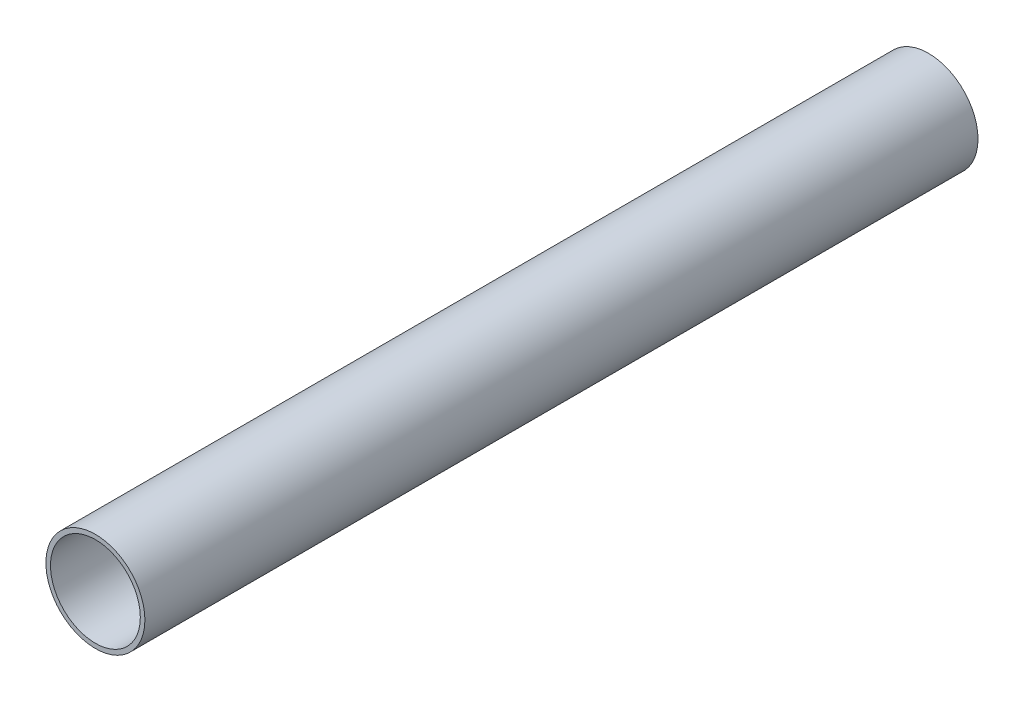
ISO-10303-21;
HEADER;
FILE_DESCRIPTION(('STEP AP214'),'2;1');
FILE_NAME('part.step','',(''),(''),'','','');
FILE_SCHEMA(('AUTOMOTIVE_DESIGN { 1 0 10303 214 1 1 1 1 }'));
ENDSEC;
DATA;
#1=APPLICATION_CONTEXT('core data for automotive mechanical design processes');
#2=APPLICATION_PROTOCOL_DEFINITION('international standard','automotive_design',2000,#1);
#3=PRODUCT_CONTEXT('',#1,'mechanical');
#4=PRODUCT('Part','Part','',(#3));
#5=PRODUCT_RELATED_PRODUCT_CATEGORY('part','',(#4));
#6=PRODUCT_DEFINITION_FORMATION('','',#4);
#7=PRODUCT_DEFINITION_CONTEXT('part definition',#1,'design');
#8=PRODUCT_DEFINITION('design','',#6,#7);
#9=PRODUCT_DEFINITION_SHAPE('','',#8);
#10=(LENGTH_UNIT() NAMED_UNIT(*) SI_UNIT(.MILLI.,.METRE.));
#11=(NAMED_UNIT(*) PLANE_ANGLE_UNIT() SI_UNIT($,.RADIAN.));
#12=(NAMED_UNIT(*) SI_UNIT($,.STERADIAN.) SOLID_ANGLE_UNIT());
#13=UNCERTAINTY_MEASURE_WITH_UNIT(LENGTH_MEASURE(1.E-05),#10,'distance_accuracy_value','');
#14=(GEOMETRIC_REPRESENTATION_CONTEXT(3) GLOBAL_UNCERTAINTY_ASSIGNED_CONTEXT((#13)) GLOBAL_UNIT_ASSIGNED_CONTEXT((#10,
#11,#12)) REPRESENTATION_CONTEXT('',''));
#15=CARTESIAN_POINT('',(0.,0.,0.));
#16=DIRECTION('',(0.,0.,1.));
#17=DIRECTION('',(1.,0.,0.));
#18=AXIS2_PLACEMENT_3D('',#15,#16,#17);
#19=CARTESIAN_POINT('',(0.,0.,914.4));
#20=DIRECTION('',(0.,0.,-1.));
#21=DIRECTION('',(-1.,0.,0.));
#22=AXIS2_PLACEMENT_3D('',#19,#20,#21);
#23=CYLINDRICAL_SURFACE('',#22,19.2405);
#24=CARTESIAN_POINT('',(0.,0.,0.));
#25=DIRECTION('',(0.,0.,1.));
#26=DIRECTION('',(1.,0.,0.));
#27=AXIS2_PLACEMENT_3D('',#24,#25,#26);
#28=CIRCLE('',#27,19.2405);
#29=CARTESIAN_POINT('',(19.2405,0.,0.));
#30=VERTEX_POINT('',#29);
#31=EDGE_CURVE('E10',#30,#30,#28,.T.);
#32=ORIENTED_EDGE('',*,*,#31,.T.);
#33=EDGE_LOOP('',(#32));
#34=FACE_BOUND('',#33,.T.);
#35=CARTESIAN_POINT('',(0.,0.,323.85));
#36=DIRECTION('',(0.,0.,1.));
#37=DIRECTION('',(1.,0.,0.));
#38=AXIS2_PLACEMENT_3D('',#35,#36,#37);
#39=CIRCLE('',#38,19.2405);
#40=CARTESIAN_POINT('',(19.2405,0.,323.85));
#41=VERTEX_POINT('',#40);
#42=EDGE_CURVE('E43',#41,#41,#39,.T.);
#43=ORIENTED_EDGE('',*,*,#42,.F.);
#44=EDGE_LOOP('',(#43));
#45=FACE_BOUND('',#44,.T.);
#46=ADVANCED_FACE('F30',(#34,#45),#23,.T.);
#47=CARTESIAN_POINT('',(0.,0.,914.4));
#48=DIRECTION('',(0.,0.,-1.));
#49=DIRECTION('',(-1.,0.,0.));
#50=AXIS2_PLACEMENT_3D('',#47,#48,#49);
#51=CYLINDRICAL_SURFACE('',#50,17.4625);
#52=CARTESIAN_POINT('',(0.,0.,0.));
#53=DIRECTION('',(0.,0.,1.));
#54=DIRECTION('',(1.,0.,0.));
#55=AXIS2_PLACEMENT_3D('',#52,#53,#54);
#56=CIRCLE('',#55,17.4625);
#57=CARTESIAN_POINT('',(17.4625,0.,0.));
#58=VERTEX_POINT('',#57);
#59=EDGE_CURVE('E37',#58,#58,#56,.T.);
#60=ORIENTED_EDGE('',*,*,#59,.F.);
#61=EDGE_LOOP('',(#60));
#62=FACE_BOUND('',#61,.T.);
#63=CARTESIAN_POINT('',(0.,0.,323.85));
#64=DIRECTION('',(0.,0.,1.));
#65=DIRECTION('',(1.,0.,0.));
#66=AXIS2_PLACEMENT_3D('',#63,#64,#65);
#67=CIRCLE('',#66,17.4625);
#68=CARTESIAN_POINT('',(17.4625,0.,323.85));
#69=VERTEX_POINT('',#68);
#70=EDGE_CURVE('E33',#69,#69,#67,.T.);
#71=ORIENTED_EDGE('',*,*,#70,.T.);
#72=EDGE_LOOP('',(#71));
#73=FACE_BOUND('',#72,.T.);
#74=ADVANCED_FACE('F50',(#62,#73),#51,.F.);
#75=CARTESIAN_POINT('',(0.,0.,0.));
#76=DIRECTION('',(0.,0.,1.));
#77=DIRECTION('',(1.,0.,0.));
#78=AXIS2_PLACEMENT_3D('',#75,#76,#77);
#79=PLANE('',#78);
#80=ORIENTED_EDGE('',*,*,#31,.F.);
#81=EDGE_LOOP('',(#80));
#82=FACE_BOUND('',#81,.T.);
#83=ORIENTED_EDGE('',*,*,#59,.T.);
#84=EDGE_LOOP('',(#83));
#85=FACE_BOUND('',#84,.T.);
#86=ADVANCED_FACE('F54',(#82,#85),#79,.F.);
#87=CARTESIAN_POINT('',(0.,0.,323.85));
#88=DIRECTION('',(0.,0.,1.));
#89=DIRECTION('',(1.,0.,0.));
#90=AXIS2_PLACEMENT_3D('',#87,#88,#89);
#91=PLANE('',#90);
#92=ORIENTED_EDGE('',*,*,#70,.F.);
#93=EDGE_LOOP('',(#92));
#94=FACE_BOUND('',#93,.T.);
#95=ORIENTED_EDGE('',*,*,#42,.T.);
#96=EDGE_LOOP('',(#95));
#97=FACE_BOUND('',#96,.T.);
#98=ADVANCED_FACE('F52',(#94,#97),#91,.T.);
#99=CLOSED_SHELL('',(#46,#74,#86,#98));
#100=MANIFOLD_SOLID_BREP('B2',#99);
#101=ADVANCED_BREP_SHAPE_REPRESENTATION('',(#18,#100),#14);
#102=SHAPE_DEFINITION_REPRESENTATION(#9,#101);
ENDSEC;
END-ISO-10303-21;
